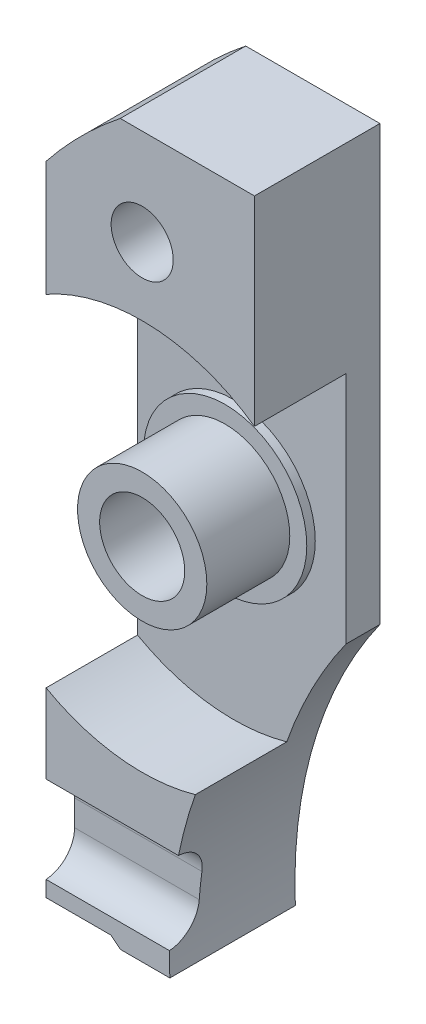
ISO-10303-21;
HEADER;
FILE_DESCRIPTION(('STEP AP214'),'2;1');
FILE_NAME('part.step','',(''),(''),'','','');
FILE_SCHEMA(('AUTOMOTIVE_DESIGN { 1 0 10303 214 1 1 1 1 }'));
ENDSEC;
DATA;
#1=APPLICATION_CONTEXT('core data for automotive mechanical design processes');
#2=APPLICATION_PROTOCOL_DEFINITION('international standard','automotive_design',2000,#1);
#3=PRODUCT_CONTEXT('',#1,'mechanical');
#4=PRODUCT('Part','Part','',(#3));
#5=PRODUCT_RELATED_PRODUCT_CATEGORY('part','',(#4));
#6=PRODUCT_DEFINITION_FORMATION('','',#4);
#7=PRODUCT_DEFINITION_CONTEXT('part definition',#1,'design');
#8=PRODUCT_DEFINITION('design','',#6,#7);
#9=PRODUCT_DEFINITION_SHAPE('','',#8);
#10=(LENGTH_UNIT() NAMED_UNIT(*) SI_UNIT(.MILLI.,.METRE.));
#11=(NAMED_UNIT(*) PLANE_ANGLE_UNIT() SI_UNIT($,.RADIAN.));
#12=(NAMED_UNIT(*) SI_UNIT($,.STERADIAN.) SOLID_ANGLE_UNIT());
#13=UNCERTAINTY_MEASURE_WITH_UNIT(LENGTH_MEASURE(1.E-05),#10,'distance_accuracy_value','');
#14=(GEOMETRIC_REPRESENTATION_CONTEXT(3) GLOBAL_UNCERTAINTY_ASSIGNED_CONTEXT((#13)) GLOBAL_UNIT_ASSIGNED_CONTEXT((#10,
#11,#12)) REPRESENTATION_CONTEXT('',''));
#15=CARTESIAN_POINT('',(0.,0.,0.));
#16=DIRECTION('',(0.,0.,1.));
#17=DIRECTION('',(1.,0.,0.));
#18=AXIS2_PLACEMENT_3D('',#15,#16,#17);
#19=CARTESIAN_POINT('',(0.,0.,7.375));
#20=DIRECTION('',(0.,0.,-1.));
#21=DIRECTION('',(-1.,0.,0.));
#22=AXIS2_PLACEMENT_3D('',#19,#20,#21);
#23=PLANE('',#22);
#24=DIRECTION('',(-1.,0.,0.));
#25=VECTOR('',#24,1.);
#26=CARTESIAN_POINT('',(6.125,-19.7692260916635,7.375));
#27=LINE('',#26,#25);
#28=CARTESIAN_POINT('',(-6.125,-19.7692260916635,7.375));
#29=VERTEX_POINT('',#28);
#30=CARTESIAN_POINT('',(1.12839404484273,-19.7692260916635,7.375));
#31=VERTEX_POINT('',#30);
#32=EDGE_CURVE('E176',#29,#31,#27,.F.);
#33=ORIENTED_EDGE('',*,*,#32,.F.);
#34=DIRECTION('',(0.,-1.,0.));
#35=VECTOR('',#34,1.);
#36=CARTESIAN_POINT('',(-6.125,-21.15,7.375));
#37=LINE('',#36,#35);
#38=CARTESIAN_POINT('',(-6.125,-20.6988030491161,7.375));
#39=VERTEX_POINT('',#38);
#40=EDGE_CURVE('E170',#29,#39,#37,.T.);
#41=ORIENTED_EDGE('',*,*,#40,.T.);
#42=DIRECTION('',(-1.,0.,0.));
#43=VECTOR('',#42,1.);
#44=CARTESIAN_POINT('',(500000.,-20.6988030491161,7.375));
#45=LINE('',#44,#43);
#46=CARTESIAN_POINT('',(-2.31105461083564,-20.6988030491161,7.375));
#47=VERTEX_POINT('',#46);
#48=EDGE_CURVE('E182',#47,#39,#45,.T.);
#49=ORIENTED_EDGE('',*,*,#48,.F.);
#50=CARTESIAN_POINT('',(15.0221,0.00292999999999433,7.375));
#51=DIRECTION('',(0.,0.,-1.));
#52=DIRECTION('',(-1.,0.,0.));
#53=AXIS2_PLACEMENT_3D('',#50,#51,#52);
#54=CIRCLE('',#53,27.);
#55=CARTESIAN_POINT('',(-1.75745757507033,-21.15,7.375));
#56=VERTEX_POINT('',#55);
#57=EDGE_CURVE('E326',#56,#47,#54,.T.);
#58=ORIENTED_EDGE('',*,*,#57,.F.);
#59=DIRECTION('',(1.,0.,0.));
#60=VECTOR('',#59,1.);
#61=CARTESIAN_POINT('',(-6.125,-21.15,7.375));
#62=LINE('',#61,#60);
#63=CARTESIAN_POINT('',(1.15186307908034,-21.15,7.375));
#64=VERTEX_POINT('',#63);
#65=EDGE_CURVE('E278',#56,#64,#62,.T.);
#66=ORIENTED_EDGE('',*,*,#65,.T.);
#67=CARTESIAN_POINT('',(28.1274,-20.00091,7.375));
#68=DIRECTION('',(0.,0.,1.));
#69=DIRECTION('',(-1.,0.,0.));
#70=AXIS2_PLACEMENT_3D('',#67,#68,#69);
#71=CIRCLE('',#70,27.);
#72=EDGE_CURVE('E295',#31,#64,#71,.T.);
#73=ORIENTED_EDGE('',*,*,#72,.F.);
#74=EDGE_LOOP('',(#33,#41,#49,#58,#66,#73));
#75=FACE_BOUND('',#74,.T.);
#76=ADVANCED_FACE('F33',(#75),#23,.F.);
#77=DIRECTION('',(-1.,0.,0.));
#78=VECTOR('',#77,1.);
#79=CARTESIAN_POINT('',(6.125,-14.6638271380924,7.375));
#80=LINE('',#79,#78);
#81=CARTESIAN_POINT('',(1.66014576906151,-14.6638271380924,7.375));
#82=VERTEX_POINT('',#81);
#83=CARTESIAN_POINT('',(-6.125,-14.6638271380924,7.375));
#84=VERTEX_POINT('',#83);
#85=EDGE_CURVE('E158',#82,#84,#80,.T.);
#86=ORIENTED_EDGE('',*,*,#85,.F.);
#87=CARTESIAN_POINT('',(2.64799421793108,-11.0678320873949,7.375));
#88=VERTEX_POINT('',#87);
#89=EDGE_CURVE('E285',#88,#82,#71,.T.);
#90=ORIENTED_EDGE('',*,*,#89,.F.);
#91=CARTESIAN_POINT('',(-0.475000000000001,0.,7.375));
#92=DIRECTION('',(0.,0.,1.));
#93=DIRECTION('',(1.,0.,0.));
#94=AXIS2_PLACEMENT_3D('',#91,#92,#93);
#95=CIRCLE('',#94,11.5);
#96=CARTESIAN_POINT('',(-6.125,-10.0163616148779,7.375));
#97=VERTEX_POINT('',#96);
#98=EDGE_CURVE('E292',#97,#88,#95,.T.);
#99=ORIENTED_EDGE('',*,*,#98,.F.);
#100=EDGE_CURVE('E319',#97,#84,#37,.T.);
#101=ORIENTED_EDGE('',*,*,#100,.T.);
#102=EDGE_LOOP('',(#86,#90,#99,#101));
#103=FACE_BOUND('',#102,.T.);
#104=ADVANCED_FACE('F219',(#103),#23,.F.);
#105=CARTESIAN_POINT('',(28.1274,-20.00091,0.));
#106=DIRECTION('',(0.,0.,1.));
#107=DIRECTION('',(1.,0.,0.));
#108=AXIS2_PLACEMENT_3D('',#105,#106,#107);
#109=CYLINDRICAL_SURFACE('',#108,27.);
#110=CARTESIAN_POINT('',(1.12839404484273,-19.7692260916635,7.375));
#111=CARTESIAN_POINT('',(1.12842503182402,-19.7657096248542,7.32448999628704));
#112=CARTESIAN_POINT('',(1.12847327968903,-19.7600629818524,7.27415259914012));
#113=CARTESIAN_POINT('',(1.12861576701967,-19.7445530263459,7.17413422321147));
#114=CARTESIAN_POINT('',(1.12871000432756,-19.7346899116719,7.12445321374575));
#115=CARTESIAN_POINT('',(1.12907851688507,-19.6988787372734,6.97701152358637));
#116=CARTESIAN_POINT('',(1.12943861874672,-19.6666973208001,6.88068893870705));
#117=CARTESIAN_POINT('',(1.13054913401151,-19.586623934175,6.69481575344124));
#118=CARTESIAN_POINT('',(1.13129973964905,-19.5387242306293,6.6052685132641));
#119=CARTESIAN_POINT('',(1.13341055971902,-19.428584141865,6.43549630073926));
#120=CARTESIAN_POINT('',(1.13477063573938,-19.3663470142653,6.35526921697007));
#121=CARTESIAN_POINT('',(1.13834019473901,-19.229331308996,6.2064400174076));
#122=CARTESIAN_POINT('',(1.14054934758834,-19.154557612038,6.13783339837393));
#123=CARTESIAN_POINT('',(1.14604261958903,-18.9945557954896,6.0141273927679));
#124=CARTESIAN_POINT('',(1.14932709403379,-18.9093242263759,5.95903248109119));
#125=CARTESIAN_POINT('',(1.15713722974379,-18.7309120322865,5.86395068034605));
#126=CARTESIAN_POINT('',(1.16166255194691,-18.6377335835836,5.82395967121725));
#127=CARTESIAN_POINT('',(1.17203393118198,-18.4461084153464,5.76020720151635));
#128=CARTESIAN_POINT('',(1.17787853213127,-18.3476675946021,5.7364279635323));
#129=CARTESIAN_POINT('',(1.18731416655469,-18.2026134875643,5.71403657318468));
#130=CARTESIAN_POINT('',(1.19040373191891,-18.1569083334542,5.70877028456504));
#131=CARTESIAN_POINT('',(1.19682939219678,-18.0653298276656,5.70175582665198));
#132=CARTESIAN_POINT('',(1.20016502947253,-18.0194569318405,5.70000128919743));
#133=CARTESIAN_POINT('',(1.20362056485734,-17.9735716148779,5.69999999999996));
#134=B_SPLINE_CURVE_WITH_KNOTS('',3,(#110,#111,#112,#113,#114,#115,#116,#117,#118,#119,#120,
#121,#122,#123,#124,#125,#126,#127,#128,#129,#130,#131,#132,#133),.UNSPECIFIED.,.F.,.F.,(4,2,2,
2,2,2,2,2,2,2,2,4),(0.,0.151803540183416,0.303599958751423,0.606708096825224,0.909965588194289,
1.21315424400167,1.51622513594801,1.8193962657577,2.12248463635631,2.42524011113193,
2.56346037779798,2.70142976982534),.UNSPECIFIED.);
#135=CARTESIAN_POINT('',(1.20362056485735,-17.9735716148779,5.7));
#136=VERTEX_POINT('',#135);
#137=EDGE_CURVE('E11',#31,#136,#134,.T.);
#138=ORIENTED_EDGE('',*,*,#137,.F.);
#139=ORIENTED_EDGE('',*,*,#72,.T.);
#140=DIRECTION('',(0.,0.,1.));
#141=VECTOR('',#140,1.);
#142=CARTESIAN_POINT('',(1.15186307908034,-21.15,0.));
#143=LINE('',#142,#141);
#144=CARTESIAN_POINT('',(1.15186307908034,-21.15,0.));
#145=VERTEX_POINT('',#144);
#146=EDGE_CURVE('E302',#145,#64,#143,.T.);
#147=ORIENTED_EDGE('',*,*,#146,.F.);
#148=CARTESIAN_POINT('',(28.1274,-20.00091,0.));
#149=DIRECTION('',(0.,0.,1.));
#150=DIRECTION('',(-1.,0.,0.));
#151=AXIS2_PLACEMENT_3D('',#148,#149,#150);
#152=CIRCLE('',#151,27.);
#153=CARTESIAN_POINT('',(6.125,-4.35180797336603,0.));
#154=VERTEX_POINT('',#153);
#155=EDGE_CURVE('E294',#154,#145,#152,.T.);
#156=ORIENTED_EDGE('',*,*,#155,.F.);
#157=DIRECTION('',(0.,0.,1.));
#158=VECTOR('',#157,1.);
#159=CARTESIAN_POINT('',(6.125,-4.35180797336603,0.));
#160=LINE('',#159,#158);
#161=CARTESIAN_POINT('',(6.125,-4.35180797336603,2.));
#162=VERTEX_POINT('',#161);
#163=EDGE_CURVE('E298',#154,#162,#160,.T.);
#164=ORIENTED_EDGE('',*,*,#163,.T.);
#165=CARTESIAN_POINT('',(28.1274,-20.00091,2.));
#166=DIRECTION('',(0.,0.,1.));
#167=DIRECTION('',(1.,0.,0.));
#168=AXIS2_PLACEMENT_3D('',#165,#166,#167);
#169=CIRCLE('',#168,27.);
#170=CARTESIAN_POINT('',(2.64799421793108,-11.0678320873949,2.));
#171=VERTEX_POINT('',#170);
#172=EDGE_CURVE('E277',#171,#162,#169,.F.);
#173=ORIENTED_EDGE('',*,*,#172,.F.);
#174=DIRECTION('',(0.,0.,1.));
#175=VECTOR('',#174,1.);
#176=CARTESIAN_POINT('',(2.64799421793108,-11.0678320873949,4.6875));
#177=LINE('',#176,#175);
#178=EDGE_CURVE('E211',#171,#88,#177,.T.);
#179=ORIENTED_EDGE('',*,*,#178,.T.);
#180=ORIENTED_EDGE('',*,*,#89,.T.);
#181=CARTESIAN_POINT('',(1.36066159217281,-16.4594816148779,5.7));
#182=CARTESIAN_POINT('',(1.36743418112757,-16.4082868582571,5.70000051217201));
#183=CARTESIAN_POINT('',(1.37435213839834,-16.3571370161651,5.7021853735845));
#184=CARTESIAN_POINT('',(1.38842782816038,-16.2552450659069,5.71089282639241));
#185=CARTESIAN_POINT('',(1.39558554237797,-16.2045029270304,5.71741508791303));
#186=CARTESIAN_POINT('',(1.41732059797834,-16.0535120617611,5.74341466465026));
#187=CARTESIAN_POINT('',(1.4321815314059,-15.954335446752,5.76932498935356));
#188=CARTESIAN_POINT('',(1.46207029216021,-15.7618404423731,5.83754922089857));
#189=CARTESIAN_POINT('',(1.47709817664981,-15.6685241371479,5.8798689255695));
#190=CARTESIAN_POINT('',(1.50667497939509,-15.4903495755816,5.97973541546311));
#191=CARTESIAN_POINT('',(1.5212239828583,-15.4054898090562,6.03727947515979));
#192=CARTESIAN_POINT('',(1.54915864586955,-15.2465842638596,6.16607725848569));
#193=CARTESIAN_POINT('',(1.56254350412426,-15.1725459101968,6.23734031830895));
#194=CARTESIAN_POINT('',(1.58744384384014,-15.037498295638,6.39163506779731));
#195=CARTESIAN_POINT('',(1.59895874004369,-14.9764931119639,6.47467042676548));
#196=CARTESIAN_POINT('',(1.61935649927753,-14.8699694680983,6.64923236891839));
#197=CARTESIAN_POINT('',(1.62826526367222,-14.8242978892227,6.74066262772758));
#198=CARTESIAN_POINT('',(1.64307333203198,-14.7490602030802,6.93007955656534));
#199=CARTESIAN_POINT('',(1.64897690232343,-14.719471260017,7.02805670733209));
#200=CARTESIAN_POINT('',(1.65492658519208,-14.6897689411836,7.16854499710955));
#201=CARTESIAN_POINT('',(1.656372235709,-14.6825714139923,7.20960344172615));
#202=CARTESIAN_POINT('',(1.65868984499392,-14.6710492507422,7.29206693647747));
#203=CARTESIAN_POINT('',(1.65956276635105,-14.6667197941817,7.33347128598806));
#204=CARTESIAN_POINT('',(1.6601457690615,-14.6638271380924,7.375));
#205=B_SPLINE_CURVE_WITH_KNOTS('',3,(#181,#182,#183,#184,#185,#186,#187,#188,#189,#190,#191,
#192,#193,#194,#195,#196,#197,#198,#199,#200,#201,#202,#203,#204),.UNSPECIFIED.,.F.,.F.,(4,2,2,
2,2,2,2,2,2,2,2,4),(0.,0.154825815729288,0.309639857747761,0.618779636988535,0.928028742435932,
1.23722252226769,1.54662746641776,1.85612906175659,2.16244110561251,2.46831707200993,
2.59336181326382,2.71819584905735),.UNSPECIFIED.);
#206=CARTESIAN_POINT('',(1.36066159217281,-16.4594816148779,5.7));
#207=VERTEX_POINT('',#206);
#208=EDGE_CURVE('E206',#207,#82,#205,.T.);
#209=ORIENTED_EDGE('',*,*,#208,.F.);
#210=CARTESIAN_POINT('',(28.1274,-20.00091,5.7));
#211=DIRECTION('',(0.,0.,1.));
#212=DIRECTION('',(1.,0.,0.));
#213=AXIS2_PLACEMENT_3D('',#210,#211,#212);
#214=CIRCLE('',#213,27.);
#215=EDGE_CURVE('E46',#136,#207,#214,.F.);
#216=ORIENTED_EDGE('',*,*,#215,.F.);
#217=EDGE_LOOP('',(#138,#139,#147,#156,#164,#173,#179,#180,#209,#216));
#218=FACE_BOUND('',#217,.T.);
#219=ADVANCED_FACE('F213',(#218),#109,.F.);
#220=CARTESIAN_POINT('',(15.0221,0.00292999999999433,0.));
#221=DIRECTION('',(0.,0.,1.));
#222=DIRECTION('',(1.,0.,0.));
#223=AXIS2_PLACEMENT_3D('',#220,#221,#222);
#224=CYLINDRICAL_SURFACE('',#223,27.);
#225=CARTESIAN_POINT('',(-2.3110546108255,-20.6988030491161,7.375));
#226=CARTESIAN_POINT('',(-2.2820948272012,-20.72305080461,7.3134682850291));
#227=CARTESIAN_POINT('',(-2.25466239884807,-20.7459157994795,7.25068275031604));
#228=CARTESIAN_POINT('',(-2.20323317431483,-20.7886310481853,7.12264823675203));
#229=CARTESIAN_POINT('',(-2.17923989752585,-20.8084782150288,7.05739681953709));
#230=CARTESIAN_POINT('',(-2.11293396460218,-20.8631650717134,6.85777531714124));
#231=CARTESIAN_POINT('',(-2.07648681010733,-20.8929905874858,6.71993507254993));
#232=CARTESIAN_POINT('',(-2.02236559985712,-20.9371622807586,6.43725550111173));
#233=CARTESIAN_POINT('',(-2.00480587413154,-20.9514141957806,6.29237903653268));
#234=CARTESIAN_POINT('',(-1.99078912782719,-20.9627968457077,6.00130460238905));
#235=CARTESIAN_POINT('',(-1.99427055471443,-20.959977519759,5.85511173539656));
#236=CARTESIAN_POINT('',(-2.02074533500306,-20.9384560716318,5.57691643167035));
#237=CARTESIAN_POINT('',(-2.0422581273985,-20.9209590510932,5.44467111623725));
#238=CARTESIAN_POINT('',(-2.10095537718778,-20.8729507786632,5.18605474589935));
#239=CARTESIAN_POINT('',(-2.13816441426491,-20.8424191141399,5.05969325092045));
#240=CARTESIAN_POINT('',(-2.24219349459339,-20.7564111076652,4.76862428788398));
#241=CARTESIAN_POINT('',(-2.31489129957211,-20.6958664167017,4.60753168312158));
#242=CARTESIAN_POINT('',(-2.47816672753617,-20.5580051995076,4.30253358978074));
#243=CARTESIAN_POINT('',(-2.56877758379673,-20.480657472583,4.1586608572078));
#244=CARTESIAN_POINT('',(-2.73644121106582,-20.3352870460461,3.9242940831755));
#245=CARTESIAN_POINT('',(-2.81065252264623,-20.2702903607505,3.82980576122855));
#246=CARTESIAN_POINT('',(-2.96413430901589,-20.1342465978488,3.64969899087923));
#247=CARTESIAN_POINT('',(-3.04340563402321,-20.0631985027692,3.56408203947885));
#248=CARTESIAN_POINT('',(-3.2058843798418,-19.9157208849801,3.40123758520768));
#249=CARTESIAN_POINT('',(-3.28909942117617,-19.8392807914575,3.32402736162936));
#250=CARTESIAN_POINT('',(-3.4583234585874,-19.6817675859164,3.17788839773647));
#251=CARTESIAN_POINT('',(-3.5443323544034,-19.6006946400744,3.10895936065772));
#252=CARTESIAN_POINT('',(-3.7473372381329,-19.4067050563337,2.95752040179185));
#253=CARTESIAN_POINT('',(-3.86511948057541,-19.2921703607962,2.87812537747921));
#254=CARTESIAN_POINT('',(-4.10279133435879,-19.0566229607436,2.73326803629247));
#255=CARTESIAN_POINT('',(-4.22268165003717,-18.935608062375,2.66781047570557));
#256=CARTESIAN_POINT('',(-4.46326192532979,-18.6879882011495,2.5508374900428));
#257=CARTESIAN_POINT('',(-4.58395111263771,-18.5613881118472,2.49931017896906));
#258=CARTESIAN_POINT('',(-4.82515184151446,-18.3032941404835,2.41031966866131));
#259=CARTESIAN_POINT('',(-4.94566341991633,-18.1718014882901,2.37285296084727));
#260=CARTESIAN_POINT('',(-5.24672749004662,-17.8365706169533,2.29694969360635));
#261=CARTESIAN_POINT('',(-5.42667504096161,-17.6300710933541,2.26769283949927));
#262=CARTESIAN_POINT('',(-5.69226970971814,-17.3156665630896,2.25002147985936));
#263=CARTESIAN_POINT('',(-5.78004358415051,-17.2101352517471,2.24849507619411));
#264=CARTESIAN_POINT('',(-5.95389121749653,-16.997853589316,2.25450106602349));
#265=CARTESIAN_POINT('',(-6.0399641118543,-16.8911026597301,2.2620379515605));
#266=CARTESIAN_POINT('',(-6.12499999988358,-16.7839744673199,2.27427618975461));
#267=B_SPLINE_CURVE_WITH_KNOTS('',3,(#225,#226,#227,#228,#229,#230,#231,#232,#233,#234,#235,
#236,#237,#238,#239,#240,#241,#242,#243,#244,#245,#246,#247,#248,#249,#250,#251,#252,#253,#254,
#255,#256,#257,#258,#259,#260,#261,#262,#263,#264,#265,#266),.UNSPECIFIED.,.F.,.F.,(4,2,2,2,2,2,
2,2,2,2,2,2,2,2,2,2,2,2,2,2,4),(0.,0.216526524869718,0.433273069933215,0.868158772119792,
1.30566237567591,1.74188675294831,2.14544692021297,2.54964140616183,3.10700656858856,
3.66541565726836,4.07469888630218,4.48405106786149,4.89422935611738,5.30439294085723,
5.85106306205822,6.39791944150342,6.94430773193654,7.49055958983515,8.3143601241319,
8.72590893484795,9.1376618057969),.UNSPECIFIED.);
#268=CARTESIAN_POINT('',(-6.125,-16.7839744671732,2.27427618977138));
#269=VERTEX_POINT('',#268);
#270=EDGE_CURVE('E178',#47,#269,#267,.T.);
#271=ORIENTED_EDGE('',*,*,#270,.T.);
#272=DIRECTION('',(0.,0.,1.));
#273=VECTOR('',#272,1.);
#274=CARTESIAN_POINT('',(-6.125,-16.7839744671732,0.));
#275=LINE('',#274,#273);
#276=CARTESIAN_POINT('',(-6.125,-16.7839744671732,0.));
#277=VERTEX_POINT('',#276);
#278=EDGE_CURVE('E357',#277,#269,#275,.T.);
#279=ORIENTED_EDGE('',*,*,#278,.F.);
#280=CARTESIAN_POINT('',(15.0221,0.00292999999999433,0.));
#281=DIRECTION('',(0.,0.,-1.));
#282=DIRECTION('',(-1.,0.,0.));
#283=AXIS2_PLACEMENT_3D('',#280,#281,#282);
#284=CIRCLE('',#283,27.);
#285=CARTESIAN_POINT('',(-1.75745757507033,-21.15,0.));
#286=VERTEX_POINT('',#285);
#287=EDGE_CURVE('E353',#286,#277,#284,.T.);
#288=ORIENTED_EDGE('',*,*,#287,.F.);
#289=DIRECTION('',(0.,0.,1.));
#290=VECTOR('',#289,1.);
#291=CARTESIAN_POINT('',(-1.75745757507033,-21.15,0.));
#292=LINE('',#291,#290);
#293=EDGE_CURVE('E355',#286,#56,#292,.T.);
#294=ORIENTED_EDGE('',*,*,#293,.T.);
#295=ORIENTED_EDGE('',*,*,#57,.T.);
#296=EDGE_LOOP('',(#271,#279,#288,#294,#295));
#297=FACE_BOUND('',#296,.T.);
#298=ADVANCED_FACE('F218',(#297),#224,.T.);
#299=CARTESIAN_POINT('',(-0.475000000000001,0.,2.5));
#300=DIRECTION('',(0.,0.,1.));
#301=DIRECTION('',(1.,0.,0.));
#302=AXIS2_PLACEMENT_3D('',#299,#300,#301);
#303=PLANE('',#302);
#304=CARTESIAN_POINT('',(-0.475000000000001,0.,2.5));
#305=DIRECTION('',(0.,0.,1.));
#306=DIRECTION('',(1.,0.,0.));
#307=AXIS2_PLACEMENT_3D('',#304,#305,#306);
#308=CIRCLE('',#307,4.8);
#309=CARTESIAN_POINT('',(4.325,0.,2.5));
#310=VERTEX_POINT('',#309);
#311=EDGE_CURVE('E419',#310,#310,#308,.T.);
#312=ORIENTED_EDGE('',*,*,#311,.T.);
#313=EDGE_LOOP('',(#312));
#314=FACE_BOUND('',#313,.T.);
#315=CARTESIAN_POINT('',(-0.475000000000001,0.,2.5));
#316=DIRECTION('',(0.,0.,1.));
#317=DIRECTION('',(1.,0.,0.));
#318=AXIS2_PLACEMENT_3D('',#315,#316,#317);
#319=CIRCLE('',#318,3.8);
#320=CARTESIAN_POINT('',(3.325,0.,2.5));
#321=VERTEX_POINT('',#320);
#322=EDGE_CURVE('E412',#321,#321,#319,.T.);
#323=ORIENTED_EDGE('',*,*,#322,.F.);
#324=EDGE_LOOP('',(#323));
#325=FACE_BOUND('',#324,.T.);
#326=ADVANCED_FACE('F382',(#314,#325),#303,.T.);
#327=CARTESIAN_POINT('',(-0.475000000000001,0.,2.));
#328=DIRECTION('',(0.,0.,1.));
#329=DIRECTION('',(1.,0.,0.));
#330=AXIS2_PLACEMENT_3D('',#327,#328,#329);
#331=PLANE('',#330);
#332=DIRECTION('',(0.,-1.,0.));
#333=VECTOR('',#332,1.);
#334=CARTESIAN_POINT('',(-6.125,-21.15,2.));
#335=LINE('',#334,#333);
#336=CARTESIAN_POINT('',(-6.125,10.0163616148779,2.));
#337=VERTEX_POINT('',#336);
#338=CARTESIAN_POINT('',(-6.125,-10.0163616148779,2.));
#339=VERTEX_POINT('',#338);
#340=EDGE_CURVE('E338',#337,#339,#335,.T.);
#341=ORIENTED_EDGE('',*,*,#340,.T.);
#342=CARTESIAN_POINT('',(-0.475000000000001,0.,2.));
#343=DIRECTION('',(0.,0.,1.));
#344=DIRECTION('',(1.,0.,0.));
#345=AXIS2_PLACEMENT_3D('',#342,#343,#344);
#346=CIRCLE('',#345,11.5);
#347=EDGE_CURVE('E61',#339,#171,#346,.T.);
#348=ORIENTED_EDGE('',*,*,#347,.T.);
#349=ORIENTED_EDGE('',*,*,#172,.T.);
#350=DIRECTION('',(0.,1.,0.));
#351=VECTOR('',#350,1.);
#352=CARTESIAN_POINT('',(6.125,-21.15,2.));
#353=LINE('',#352,#351);
#354=CARTESIAN_POINT('',(6.125,9.41753683295159,2.));
#355=VERTEX_POINT('',#354);
#356=EDGE_CURVE('E334',#162,#355,#353,.T.);
#357=ORIENTED_EDGE('',*,*,#356,.T.);
#358=EDGE_CURVE('E339',#355,#337,#346,.T.);
#359=ORIENTED_EDGE('',*,*,#358,.T.);
#360=EDGE_LOOP('',(#341,#348,#349,#357,#359));
#361=FACE_BOUND('',#360,.T.);
#362=CARTESIAN_POINT('',(-0.475000000000001,0.,2.));
#363=DIRECTION('',(0.,0.,1.));
#364=DIRECTION('',(1.,0.,0.));
#365=AXIS2_PLACEMENT_3D('',#362,#363,#364);
#366=CIRCLE('',#365,4.8);
#367=CARTESIAN_POINT('',(4.325,0.,2.));
#368=VERTEX_POINT('',#367);
#369=EDGE_CURVE('E417',#368,#368,#366,.T.);
#370=ORIENTED_EDGE('',*,*,#369,.F.);
#371=EDGE_LOOP('',(#370));
#372=FACE_BOUND('',#371,.T.);
#373=ADVANCED_FACE('F376',(#361,#372),#331,.T.);
#374=CARTESIAN_POINT('',(-0.475000000000001,15.5,7.375));
#375=DIRECTION('',(0.,0.,1.));
#376=DIRECTION('',(1.,0.,0.));
#377=AXIS2_PLACEMENT_3D('',#374,#375,#376);
#378=CIRCLE('',#377,1.825);
#379=CARTESIAN_POINT('',(1.35,15.5,7.375));
#380=VERTEX_POINT('',#379);
#381=EDGE_CURVE('E309',#380,#380,#378,.T.);
#382=ORIENTED_EDGE('',*,*,#381,.F.);
#383=EDGE_LOOP('',(#382));
#384=FACE_BOUND('',#383,.T.);
#385=CARTESIAN_POINT('',(-6.125,16.7898344671732,7.375));
#386=VERTEX_POINT('',#385);
#387=CARTESIAN_POINT('',(-6.125,10.0163616148779,7.375));
#388=VERTEX_POINT('',#387);
#389=EDGE_CURVE('E317',#386,#388,#37,.T.);
#390=ORIENTED_EDGE('',*,*,#389,.T.);
#391=CARTESIAN_POINT('',(6.125,9.41753683295159,7.375));
#392=VERTEX_POINT('',#391);
#393=EDGE_CURVE('E345',#392,#388,#95,.T.);
#394=ORIENTED_EDGE('',*,*,#393,.F.);
#395=DIRECTION('',(0.,1.,0.));
#396=VECTOR('',#395,1.);
#397=CARTESIAN_POINT('',(6.125,-21.15,7.375));
#398=LINE('',#397,#396);
#399=CARTESIAN_POINT('',(6.125,21.15,7.375));
#400=VERTEX_POINT('',#399);
#401=EDGE_CURVE('E276',#392,#400,#398,.T.);
#402=ORIENTED_EDGE('',*,*,#401,.T.);
#403=DIRECTION('',(-1.,0.,0.));
#404=VECTOR('',#403,1.);
#405=CARTESIAN_POINT('',(-6.125,21.15,7.375));
#406=LINE('',#405,#404);
#407=CARTESIAN_POINT('',(-1.76484225924125,21.15,7.375));
#408=VERTEX_POINT('',#407);
#409=EDGE_CURVE('E315',#400,#408,#406,.T.);
#410=ORIENTED_EDGE('',*,*,#409,.T.);
#411=CARTESIAN_POINT('',(15.0221,0.00292999999999433,7.375));
#412=DIRECTION('',(0.,0.,-1.));
#413=DIRECTION('',(-1.,0.,0.));
#414=AXIS2_PLACEMENT_3D('',#411,#412,#413);
#415=CIRCLE('',#414,27.);
#416=EDGE_CURVE('E360',#386,#408,#415,.T.);
#417=ORIENTED_EDGE('',*,*,#416,.F.);
#418=EDGE_LOOP('',(#390,#394,#402,#410,#417));
#419=FACE_BOUND('',#418,.T.);
#420=ADVANCED_FACE('F228',(#384,#419),#23,.F.);
#421=CARTESIAN_POINT('',(-0.475000000000001,0.,0.));
#422=DIRECTION('',(0.,0.,1.));
#423=DIRECTION('',(1.,0.,0.));
#424=AXIS2_PLACEMENT_3D('',#421,#422,#423);
#425=CYLINDRICAL_SURFACE('',#424,2.5);
#426=CARTESIAN_POINT('',(-0.475000000000001,0.,0.));
#427=DIRECTION('',(0.,0.,1.));
#428=DIRECTION('',(1.,0.,0.));
#429=AXIS2_PLACEMENT_3D('',#426,#427,#428);
#430=CIRCLE('',#429,2.5);
#431=CARTESIAN_POINT('',(2.025,0.,0.));
#432=VERTEX_POINT('',#431);
#433=EDGE_CURVE('E305',#432,#432,#430,.T.);
#434=ORIENTED_EDGE('',*,*,#433,.F.);
#435=EDGE_LOOP('',(#434));
#436=FACE_BOUND('',#435,.T.);
#437=CARTESIAN_POINT('',(-0.475000000000001,0.,7.375));
#438=DIRECTION('',(0.,0.,1.));
#439=DIRECTION('',(1.,0.,0.));
#440=AXIS2_PLACEMENT_3D('',#437,#438,#439);
#441=CIRCLE('',#440,2.5);
#442=CARTESIAN_POINT('',(2.025,0.,7.375));
#443=VERTEX_POINT('',#442);
#444=EDGE_CURVE('E181',#443,#443,#441,.T.);
#445=ORIENTED_EDGE('',*,*,#444,.T.);
#446=EDGE_LOOP('',(#445));
#447=FACE_BOUND('',#446,.T.);
#448=ADVANCED_FACE('F223',(#436,#447),#425,.F.);
#449=CARTESIAN_POINT('',(0.,0.,0.));
#450=DIRECTION('',(0.,0.,-1.));
#451=DIRECTION('',(-1.,0.,0.));
#452=AXIS2_PLACEMENT_3D('',#449,#450,#451);
#453=PLANE('',#452);
#454=CARTESIAN_POINT('',(-0.475000000000001,15.5,0.));
#455=DIRECTION('',(0.,0.,1.));
#456=DIRECTION('',(1.,0.,0.));
#457=AXIS2_PLACEMENT_3D('',#454,#455,#456);
#458=CIRCLE('',#457,1.825);
#459=CARTESIAN_POINT('',(1.35,15.5,0.));
#460=VERTEX_POINT('',#459);
#461=EDGE_CURVE('E271',#460,#460,#458,.T.);
#462=ORIENTED_EDGE('',*,*,#461,.T.);
#463=EDGE_LOOP('',(#462));
#464=FACE_BOUND('',#463,.T.);
#465=ORIENTED_EDGE('',*,*,#433,.T.);
#466=EDGE_LOOP('',(#465));
#467=FACE_BOUND('',#466,.T.);
#468=ORIENTED_EDGE('',*,*,#287,.T.);
#469=DIRECTION('',(0.,-1.,0.));
#470=VECTOR('',#469,1.);
#471=CARTESIAN_POINT('',(-6.125,-21.15,0.));
#472=LINE('',#471,#470);
#473=CARTESIAN_POINT('',(-6.125,16.7898344671732,0.));
#474=VERTEX_POINT('',#473);
#475=EDGE_CURVE('E265',#474,#277,#472,.T.);
#476=ORIENTED_EDGE('',*,*,#475,.F.);
#477=CARTESIAN_POINT('',(15.0221,0.00292999999999433,0.));
#478=DIRECTION('',(0.,0.,-1.));
#479=DIRECTION('',(-1.,0.,0.));
#480=AXIS2_PLACEMENT_3D('',#477,#478,#479);
#481=CIRCLE('',#480,27.);
#482=CARTESIAN_POINT('',(-1.76484225924125,21.15,0.));
#483=VERTEX_POINT('',#482);
#484=EDGE_CURVE('E362',#474,#483,#481,.T.);
#485=ORIENTED_EDGE('',*,*,#484,.T.);
#486=DIRECTION('',(-1.,0.,0.));
#487=VECTOR('',#486,1.);
#488=CARTESIAN_POINT('',(-6.125,21.15,0.));
#489=LINE('',#488,#487);
#490=CARTESIAN_POINT('',(6.125,21.15,0.));
#491=VERTEX_POINT('',#490);
#492=EDGE_CURVE('E256',#491,#483,#489,.T.);
#493=ORIENTED_EDGE('',*,*,#492,.F.);
#494=DIRECTION('',(0.,1.,0.));
#495=VECTOR('',#494,1.);
#496=CARTESIAN_POINT('',(6.125,-21.15,0.));
#497=LINE('',#496,#495);
#498=EDGE_CURVE('E266',#154,#491,#497,.T.);
#499=ORIENTED_EDGE('',*,*,#498,.F.);
#500=ORIENTED_EDGE('',*,*,#155,.T.);
#501=DIRECTION('',(1.,0.,0.));
#502=VECTOR('',#501,1.);
#503=CARTESIAN_POINT('',(-6.125,-21.15,0.));
#504=LINE('',#503,#502);
#505=EDGE_CURVE('E269',#286,#145,#504,.T.);
#506=ORIENTED_EDGE('',*,*,#505,.F.);
#507=EDGE_LOOP('',(#468,#476,#485,#493,#499,#500,#506));
#508=FACE_BOUND('',#507,.T.);
#509=ADVANCED_FACE('F227',(#464,#467,#508),#453,.T.);
#510=CARTESIAN_POINT('',(6.125,-21.15,7.375));
#511=DIRECTION('',(-1.,0.,0.));
#512=DIRECTION('',(0.,0.,1.));
#513=AXIS2_PLACEMENT_3D('',#510,#511,#512);
#514=PLANE('',#513);
#515=ORIENTED_EDGE('',*,*,#401,.F.);
#516=DIRECTION('',(0.,0.,1.));
#517=VECTOR('',#516,1.);
#518=CARTESIAN_POINT('',(6.125,9.41753683295159,2.));
#519=LINE('',#518,#517);
#520=EDGE_CURVE('E335',#392,#355,#519,.F.);
#521=ORIENTED_EDGE('',*,*,#520,.T.);
#522=ORIENTED_EDGE('',*,*,#356,.F.);
#523=ORIENTED_EDGE('',*,*,#163,.F.);
#524=ORIENTED_EDGE('',*,*,#498,.T.);
#525=DIRECTION('',(0.,0.,-1.));
#526=VECTOR('',#525,1.);
#527=CARTESIAN_POINT('',(6.125,21.15,7.375));
#528=LINE('',#527,#526);
#529=EDGE_CURVE('E261',#400,#491,#528,.T.);
#530=ORIENTED_EDGE('',*,*,#529,.F.);
#531=EDGE_LOOP('',(#515,#521,#522,#523,#524,#530));
#532=FACE_BOUND('',#531,.T.);
#533=ADVANCED_FACE('F35',(#532),#514,.F.);
#534=CARTESIAN_POINT('',(-6.125,21.15,7.375));
#535=DIRECTION('',(0.,-1.,0.));
#536=DIRECTION('',(0.,0.,-1.));
#537=AXIS2_PLACEMENT_3D('',#534,#535,#536);
#538=PLANE('',#537);
#539=ORIENTED_EDGE('',*,*,#492,.T.);
#540=DIRECTION('',(0.,0.,1.));
#541=VECTOR('',#540,1.);
#542=CARTESIAN_POINT('',(-1.76484225924125,21.15,0.));
#543=LINE('',#542,#541);
#544=EDGE_CURVE('E258',#483,#408,#543,.T.);
#545=ORIENTED_EDGE('',*,*,#544,.T.);
#546=ORIENTED_EDGE('',*,*,#409,.F.);
#547=ORIENTED_EDGE('',*,*,#529,.T.);
#548=EDGE_LOOP('',(#539,#545,#546,#547));
#549=FACE_BOUND('',#548,.T.);
#550=ADVANCED_FACE('F245',(#549),#538,.F.);
#551=CARTESIAN_POINT('',(-6.125,-21.15,7.375));
#552=DIRECTION('',(1.,0.,0.));
#553=DIRECTION('',(0.,0.,-1.));
#554=AXIS2_PLACEMENT_3D('',#551,#552,#553);
#555=PLANE('',#554);
#556=CARTESIAN_POINT('',(-6.125,-17.9735716148779,7.5));
#557=DIRECTION('',(1.,0.,0.));
#558=DIRECTION('',(0.,0.,-1.));
#559=AXIS2_PLACEMENT_3D('',#556,#557,#558);
#560=CIRCLE('',#559,1.8);
#561=CARTESIAN_POINT('',(-6.125,-17.9735716148779,5.7));
#562=VERTEX_POINT('',#561);
#563=EDGE_CURVE('E153',#29,#562,#560,.T.);
#564=ORIENTED_EDGE('',*,*,#563,.T.);
#565=DIRECTION('',(0.,1.,0.));
#566=VECTOR('',#565,1.);
#567=CARTESIAN_POINT('',(-6.125,-17.9735716148779,5.7));
#568=LINE('',#567,#566);
#569=CARTESIAN_POINT('',(-6.125,-16.4594816148779,5.7));
#570=VERTEX_POINT('',#569);
#571=EDGE_CURVE('E161',#562,#570,#568,.T.);
#572=ORIENTED_EDGE('',*,*,#571,.T.);
#573=CARTESIAN_POINT('',(-6.125,-16.4594816148779,7.5));
#574=DIRECTION('',(1.,0.,0.));
#575=DIRECTION('',(0.,0.,-1.));
#576=AXIS2_PLACEMENT_3D('',#573,#574,#575);
#577=CIRCLE('',#576,1.8);
#578=EDGE_CURVE('E165',#570,#84,#577,.T.);
#579=ORIENTED_EDGE('',*,*,#578,.T.);
#580=ORIENTED_EDGE('',*,*,#100,.F.);
#581=DIRECTION('',(0.,0.,1.));
#582=VECTOR('',#581,1.);
#583=CARTESIAN_POINT('',(-6.125,-10.0163616148779,2.));
#584=LINE('',#583,#582);
#585=EDGE_CURVE('E341',#97,#339,#584,.F.);
#586=ORIENTED_EDGE('',*,*,#585,.T.);
#587=ORIENTED_EDGE('',*,*,#340,.F.);
#588=DIRECTION('',(0.,0.,1.));
#589=VECTOR('',#588,1.);
#590=CARTESIAN_POINT('',(-6.125,10.0163616148779,2.));
#591=LINE('',#590,#589);
#592=EDGE_CURVE('E349',#337,#388,#591,.T.);
#593=ORIENTED_EDGE('',*,*,#592,.T.);
#594=ORIENTED_EDGE('',*,*,#389,.F.);
#595=DIRECTION('',(0.,0.,1.));
#596=VECTOR('',#595,1.);
#597=CARTESIAN_POINT('',(-6.125,16.7898344671732,0.));
#598=LINE('',#597,#596);
#599=EDGE_CURVE('E364',#474,#386,#598,.T.);
#600=ORIENTED_EDGE('',*,*,#599,.F.);
#601=ORIENTED_EDGE('',*,*,#475,.T.);
#602=ORIENTED_EDGE('',*,*,#278,.T.);
#603=CARTESIAN_POINT('',(-6.125,-17.2099816148779,6.));
#604=DIRECTION('',(1.,0.,0.));
#605=DIRECTION('',(0.,0.,-1.));
#606=AXIS2_PLACEMENT_3D('',#603,#604,#605);
#607=CIRCLE('',#606,3.75);
#608=EDGE_CURVE('E179',#39,#269,#607,.T.);
#609=ORIENTED_EDGE('',*,*,#608,.F.);
#610=ORIENTED_EDGE('',*,*,#40,.F.);
#611=EDGE_LOOP('',(#564,#572,#579,#580,#586,#587,#593,#594,#600,#601,#602,#609,#610));
#612=FACE_BOUND('',#611,.T.);
#613=ADVANCED_FACE('F168',(#612),#555,.F.);
#614=CARTESIAN_POINT('',(-6.125,-21.15,7.375));
#615=DIRECTION('',(0.,1.,0.));
#616=DIRECTION('',(0.,0.,1.));
#617=AXIS2_PLACEMENT_3D('',#614,#615,#616);
#618=PLANE('',#617);
#619=ORIENTED_EDGE('',*,*,#65,.F.);
#620=ORIENTED_EDGE('',*,*,#293,.F.);
#621=ORIENTED_EDGE('',*,*,#505,.T.);
#622=ORIENTED_EDGE('',*,*,#146,.T.);
#623=EDGE_LOOP('',(#619,#620,#621,#622));
#624=FACE_BOUND('',#623,.T.);
#625=ADVANCED_FACE('F233',(#624),#618,.F.);
#626=CARTESIAN_POINT('',(-0.475000000000001,15.5,0.));
#627=DIRECTION('',(0.,0.,1.));
#628=DIRECTION('',(1.,0.,0.));
#629=AXIS2_PLACEMENT_3D('',#626,#627,#628);
#630=CYLINDRICAL_SURFACE('',#629,1.825);
#631=ORIENTED_EDGE('',*,*,#461,.F.);
#632=EDGE_LOOP('',(#631));
#633=FACE_BOUND('',#632,.T.);
#634=ORIENTED_EDGE('',*,*,#381,.T.);
#635=EDGE_LOOP('',(#634));
#636=FACE_BOUND('',#635,.T.);
#637=ADVANCED_FACE('F230',(#633,#636),#630,.F.);
#638=CARTESIAN_POINT('',(15.0221,0.00292999999999433,0.));
#639=DIRECTION('',(0.,0.,1.));
#640=DIRECTION('',(1.,0.,0.));
#641=AXIS2_PLACEMENT_3D('',#638,#639,#640);
#642=CYLINDRICAL_SURFACE('',#641,27.);
#643=ORIENTED_EDGE('',*,*,#416,.T.);
#644=ORIENTED_EDGE('',*,*,#544,.F.);
#645=ORIENTED_EDGE('',*,*,#484,.F.);
#646=ORIENTED_EDGE('',*,*,#599,.T.);
#647=EDGE_LOOP('',(#643,#644,#645,#646));
#648=FACE_BOUND('',#647,.T.);
#649=ADVANCED_FACE('F221',(#648),#642,.T.);
#650=CARTESIAN_POINT('',(-0.475000000000001,0.,2.));
#651=DIRECTION('',(0.,0.,1.));
#652=DIRECTION('',(1.,0.,0.));
#653=AXIS2_PLACEMENT_3D('',#650,#651,#652);
#654=CYLINDRICAL_SURFACE('',#653,11.5);
#655=ORIENTED_EDGE('',*,*,#393,.T.);
#656=ORIENTED_EDGE('',*,*,#592,.F.);
#657=ORIENTED_EDGE('',*,*,#358,.F.);
#658=ORIENTED_EDGE('',*,*,#520,.F.);
#659=EDGE_LOOP('',(#655,#656,#657,#658));
#660=FACE_BOUND('',#659,.T.);
#661=ADVANCED_FACE('F375',(#660),#654,.F.);
#662=ORIENTED_EDGE('',*,*,#98,.T.);
#663=ORIENTED_EDGE('',*,*,#178,.F.);
#664=ORIENTED_EDGE('',*,*,#347,.F.);
#665=ORIENTED_EDGE('',*,*,#585,.F.);
#666=EDGE_LOOP('',(#662,#663,#664,#665));
#667=FACE_BOUND('',#666,.T.);
#668=ADVANCED_FACE('F378',(#667),#654,.F.);
#669=CARTESIAN_POINT('',(-0.475000000000001,0.,2.5));
#670=DIRECTION('',(0.,0.,-1.));
#671=DIRECTION('',(-1.,0.,0.));
#672=AXIS2_PLACEMENT_3D('',#669,#670,#671);
#673=CYLINDRICAL_SURFACE('',#672,4.8);
#674=ORIENTED_EDGE('',*,*,#311,.F.);
#675=EDGE_LOOP('',(#674));
#676=FACE_BOUND('',#675,.T.);
#677=ORIENTED_EDGE('',*,*,#369,.T.);
#678=EDGE_LOOP('',(#677));
#679=FACE_BOUND('',#678,.T.);
#680=ADVANCED_FACE('F393',(#676,#679),#673,.T.);
#681=CARTESIAN_POINT('',(-0.475000000000001,0.,7.375));
#682=DIRECTION('',(0.,0.,1.));
#683=DIRECTION('',(1.,0.,0.));
#684=AXIS2_PLACEMENT_3D('',#681,#682,#683);
#685=PLANE('',#684);
#686=CARTESIAN_POINT('',(-0.475000000000001,0.,7.375));
#687=DIRECTION('',(0.,0.,1.));
#688=DIRECTION('',(1.,0.,0.));
#689=AXIS2_PLACEMENT_3D('',#686,#687,#688);
#690=CIRCLE('',#689,3.8);
#691=CARTESIAN_POINT('',(3.325,0.,7.375));
#692=VERTEX_POINT('',#691);
#693=EDGE_CURVE('E408',#692,#692,#690,.T.);
#694=ORIENTED_EDGE('',*,*,#693,.T.);
#695=EDGE_LOOP('',(#694));
#696=FACE_BOUND('',#695,.T.);
#697=ORIENTED_EDGE('',*,*,#444,.F.);
#698=EDGE_LOOP('',(#697));
#699=FACE_BOUND('',#698,.T.);
#700=ADVANCED_FACE('F395',(#696,#699),#685,.T.);
#701=CARTESIAN_POINT('',(-0.475000000000001,0.,7.375));
#702=DIRECTION('',(0.,0.,-1.));
#703=DIRECTION('',(-1.,0.,0.));
#704=AXIS2_PLACEMENT_3D('',#701,#702,#703);
#705=CYLINDRICAL_SURFACE('',#704,3.8);
#706=ORIENTED_EDGE('',*,*,#693,.F.);
#707=EDGE_LOOP('',(#706));
#708=FACE_BOUND('',#707,.T.);
#709=ORIENTED_EDGE('',*,*,#322,.T.);
#710=EDGE_LOOP('',(#709));
#711=FACE_BOUND('',#710,.T.);
#712=ADVANCED_FACE('F398',(#708,#711),#705,.T.);
#713=CARTESIAN_POINT('',(500000.,-17.2099816148779,6.));
#714=DIRECTION('',(-1.,0.,0.));
#715=DIRECTION('',(0.,0.,1.));
#716=AXIS2_PLACEMENT_3D('',#713,#714,#715);
#717=CYLINDRICAL_SURFACE('',#716,3.75);
#718=ORIENTED_EDGE('',*,*,#270,.F.);
#719=ORIENTED_EDGE('',*,*,#48,.T.);
#720=ORIENTED_EDGE('',*,*,#608,.T.);
#721=EDGE_LOOP('',(#718,#719,#720));
#722=FACE_BOUND('',#721,.T.);
#723=ADVANCED_FACE('F193',(#722),#717,.T.);
#724=CARTESIAN_POINT('',(6.125,-17.9735716148779,7.5));
#725=DIRECTION('',(-1.,0.,0.));
#726=DIRECTION('',(0.,0.,1.));
#727=AXIS2_PLACEMENT_3D('',#724,#725,#726);
#728=CYLINDRICAL_SURFACE('',#727,1.8);
#729=ORIENTED_EDGE('',*,*,#32,.T.);
#730=ORIENTED_EDGE('',*,*,#137,.T.);
#731=DIRECTION('',(-1.,0.,0.));
#732=VECTOR('',#731,1.);
#733=CARTESIAN_POINT('',(6.125,-17.9735716148779,5.7));
#734=LINE('',#733,#732);
#735=EDGE_CURVE('E149',#136,#562,#734,.T.);
#736=ORIENTED_EDGE('',*,*,#735,.T.);
#737=ORIENTED_EDGE('',*,*,#563,.F.);
#738=EDGE_LOOP('',(#729,#730,#736,#737));
#739=FACE_BOUND('',#738,.T.);
#740=ADVANCED_FACE('F151',(#739),#728,.F.);
#741=CARTESIAN_POINT('',(6.125,-17.9735716148779,5.7));
#742=DIRECTION('',(0.,0.,1.));
#743=DIRECTION('',(1.,0.,0.));
#744=AXIS2_PLACEMENT_3D('',#741,#742,#743);
#745=PLANE('',#744);
#746=ORIENTED_EDGE('',*,*,#215,.T.);
#747=DIRECTION('',(-1.,0.,0.));
#748=VECTOR('',#747,1.);
#749=CARTESIAN_POINT('',(6.125,-16.4594816148779,5.7));
#750=LINE('',#749,#748);
#751=EDGE_CURVE('E53',#207,#570,#750,.T.);
#752=ORIENTED_EDGE('',*,*,#751,.T.);
#753=ORIENTED_EDGE('',*,*,#571,.F.);
#754=ORIENTED_EDGE('',*,*,#735,.F.);
#755=EDGE_LOOP('',(#746,#752,#753,#754));
#756=FACE_BOUND('',#755,.T.);
#757=ADVANCED_FACE('F162',(#756),#745,.T.);
#758=CARTESIAN_POINT('',(6.125,-16.4594816148779,7.5));
#759=DIRECTION('',(-1.,0.,0.));
#760=DIRECTION('',(0.,0.,1.));
#761=AXIS2_PLACEMENT_3D('',#758,#759,#760);
#762=CYLINDRICAL_SURFACE('',#761,1.8);
#763=ORIENTED_EDGE('',*,*,#85,.T.);
#764=ORIENTED_EDGE('',*,*,#578,.F.);
#765=ORIENTED_EDGE('',*,*,#751,.F.);
#766=ORIENTED_EDGE('',*,*,#208,.T.);
#767=EDGE_LOOP('',(#763,#764,#765,#766));
#768=FACE_BOUND('',#767,.T.);
#769=ADVANCED_FACE('F202',(#768),#762,.F.);
#770=CLOSED_SHELL('',(#76,#104,#219,#298,#326,#373,#420,#448,#509,#533,#550,#613,#625,#637,#649,
#661,#668,#680,#700,#712,#723,#740,#757,#769));
#771=MANIFOLD_SOLID_BREP('B2',#770);
#772=ADVANCED_BREP_SHAPE_REPRESENTATION('',(#18,#771),#14);
#773=SHAPE_DEFINITION_REPRESENTATION(#9,#772);
ENDSEC;
END-ISO-10303-21;
